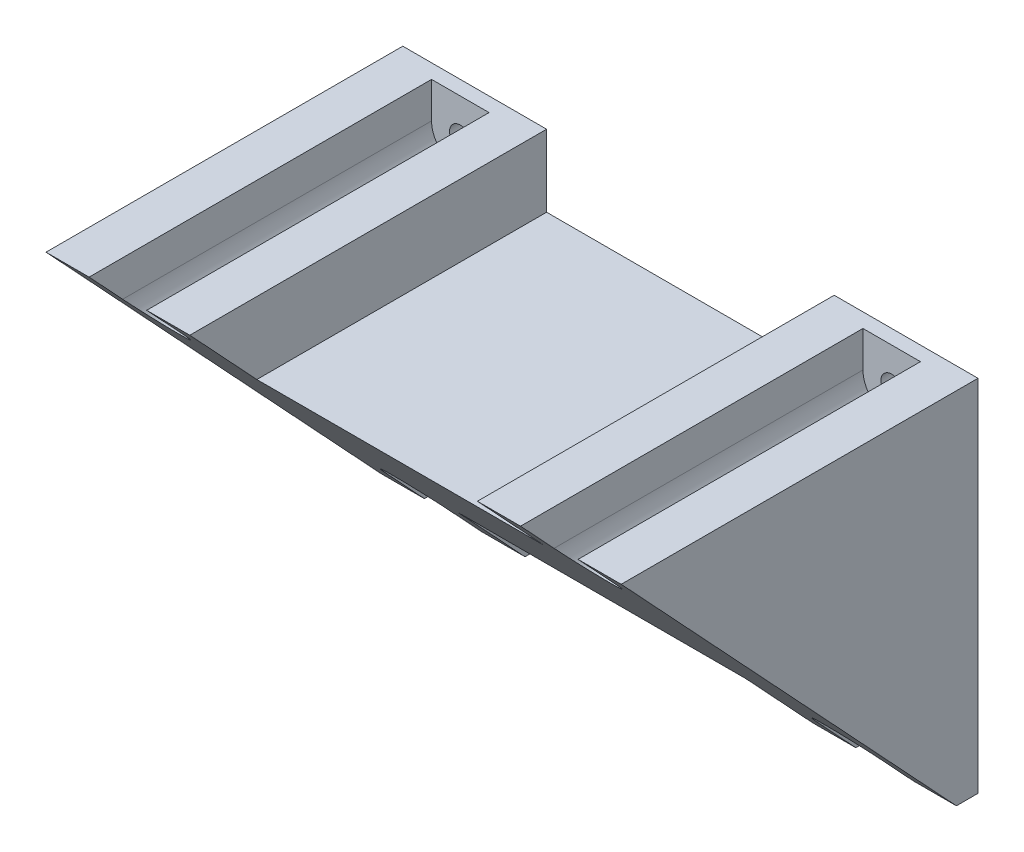
ISO-10303-21;
HEADER;
FILE_DESCRIPTION(('STEP AP214'),'2;1');
FILE_NAME('part.step','',(''),(''),'','','');
FILE_SCHEMA(('AUTOMOTIVE_DESIGN { 1 0 10303 214 1 1 1 1 }'));
ENDSEC;
DATA;
#1=APPLICATION_CONTEXT('core data for automotive mechanical design processes');
#2=APPLICATION_PROTOCOL_DEFINITION('international standard','automotive_design',2000,#1);
#3=PRODUCT_CONTEXT('',#1,'mechanical');
#4=PRODUCT('Part','Part','',(#3));
#5=PRODUCT_RELATED_PRODUCT_CATEGORY('part','',(#4));
#6=PRODUCT_DEFINITION_FORMATION('','',#4);
#7=PRODUCT_DEFINITION_CONTEXT('part definition',#1,'design');
#8=PRODUCT_DEFINITION('design','',#6,#7);
#9=PRODUCT_DEFINITION_SHAPE('','',#8);
#10=(LENGTH_UNIT() NAMED_UNIT(*) SI_UNIT(.MILLI.,.METRE.));
#11=(NAMED_UNIT(*) PLANE_ANGLE_UNIT() SI_UNIT($,.RADIAN.));
#12=(NAMED_UNIT(*) SI_UNIT($,.STERADIAN.) SOLID_ANGLE_UNIT());
#13=UNCERTAINTY_MEASURE_WITH_UNIT(LENGTH_MEASURE(1.E-05),#10,'distance_accuracy_value','');
#14=(GEOMETRIC_REPRESENTATION_CONTEXT(3) GLOBAL_UNCERTAINTY_ASSIGNED_CONTEXT((#13)) GLOBAL_UNIT_ASSIGNED_CONTEXT((#10,
#11,#12)) REPRESENTATION_CONTEXT('',''));
#15=CARTESIAN_POINT('',(0.,0.,0.));
#16=DIRECTION('',(0.,0.,1.));
#17=DIRECTION('',(1.,0.,0.));
#18=AXIS2_PLACEMENT_3D('',#15,#16,#17);
#19=CARTESIAN_POINT('',(0.,0.,2.));
#20=DIRECTION('',(0.,0.,-1.));
#21=DIRECTION('',(-1.,0.,0.));
#22=AXIS2_PLACEMENT_3D('',#19,#20,#21);
#23=PLANE('',#22);
#24=CARTESIAN_POINT('',(9.99999999999999,45.,2.));
#25=DIRECTION('',(0.,0.,1.));
#26=DIRECTION('',(1.,0.,0.));
#27=AXIS2_PLACEMENT_3D('',#24,#25,#26);
#28=CIRCLE('',#27,1.5);
#29=CARTESIAN_POINT('',(11.5,45.,2.));
#30=VERTEX_POINT('',#29);
#31=EDGE_CURVE('E298',#30,#30,#28,.T.);
#32=ORIENTED_EDGE('',*,*,#31,.F.);
#33=EDGE_LOOP('',(#32));
#34=FACE_BOUND('',#33,.T.);
#35=DIRECTION('',(0.,1.,0.));
#36=VECTOR('',#35,1.);
#37=CARTESIAN_POINT('',(6.,50.,2.));
#38=LINE('',#37,#36);
#39=CARTESIAN_POINT('',(6.,45.,2.));
#40=VERTEX_POINT('',#39);
#41=CARTESIAN_POINT('',(6.,50.,2.));
#42=VERTEX_POINT('',#41);
#43=EDGE_CURVE('E55',#40,#42,#38,.T.);
#44=ORIENTED_EDGE('',*,*,#43,.F.);
#45=CARTESIAN_POINT('',(10.,45.,2.));
#46=DIRECTION('',(0.,0.,-1.));
#47=DIRECTION('',(1.,0.,0.));
#48=AXIS2_PLACEMENT_3D('',#45,#46,#47);
#49=CIRCLE('',#48,4.);
#50=CARTESIAN_POINT('',(14.,45.,2.));
#51=VERTEX_POINT('',#50);
#52=EDGE_CURVE('E459',#51,#40,#49,.T.);
#53=ORIENTED_EDGE('',*,*,#52,.F.);
#54=DIRECTION('',(0.,-1.,0.));
#55=VECTOR('',#54,1.);
#56=CARTESIAN_POINT('',(14.,45.,2.));
#57=LINE('',#56,#55);
#58=CARTESIAN_POINT('',(14.,50.,2.));
#59=VERTEX_POINT('',#58);
#60=EDGE_CURVE('E239',#59,#51,#57,.T.);
#61=ORIENTED_EDGE('',*,*,#60,.F.);
#62=DIRECTION('',(-1.,0.,0.));
#63=VECTOR('',#62,1.);
#64=CARTESIAN_POINT('',(20.,50.,2.));
#65=LINE('',#64,#63);
#66=EDGE_CURVE('E319',#59,#42,#65,.T.);
#67=ORIENTED_EDGE('',*,*,#66,.T.);
#68=EDGE_LOOP('',(#44,#53,#61,#67));
#69=FACE_BOUND('',#68,.T.);
#70=ADVANCED_FACE('F36',(#34,#69),#23,.F.);
#71=CARTESIAN_POINT('',(70.,45.,2.));
#72=DIRECTION('',(0.,0.,1.));
#73=DIRECTION('',(1.,0.,0.));
#74=AXIS2_PLACEMENT_3D('',#71,#72,#73);
#75=CIRCLE('',#74,1.5);
#76=CARTESIAN_POINT('',(71.5,45.,2.));
#77=VERTEX_POINT('',#76);
#78=EDGE_CURVE('E292',#77,#77,#75,.T.);
#79=ORIENTED_EDGE('',*,*,#78,.F.);
#80=EDGE_LOOP('',(#79));
#81=FACE_BOUND('',#80,.T.);
#82=DIRECTION('',(0.,1.,0.));
#83=VECTOR('',#82,1.);
#84=CARTESIAN_POINT('',(66.,50.,2.));
#85=LINE('',#84,#83);
#86=CARTESIAN_POINT('',(66.,45.,2.));
#87=VERTEX_POINT('',#86);
#88=CARTESIAN_POINT('',(66.,50.,2.));
#89=VERTEX_POINT('',#88);
#90=EDGE_CURVE('E228',#87,#89,#85,.T.);
#91=ORIENTED_EDGE('',*,*,#90,.F.);
#92=CARTESIAN_POINT('',(70.,45.,2.));
#93=DIRECTION('',(0.,0.,-1.));
#94=DIRECTION('',(1.,0.,0.));
#95=AXIS2_PLACEMENT_3D('',#92,#93,#94);
#96=CIRCLE('',#95,3.99999999999999);
#97=CARTESIAN_POINT('',(74.,45.,2.));
#98=VERTEX_POINT('',#97);
#99=EDGE_CURVE('E231',#98,#87,#96,.T.);
#100=ORIENTED_EDGE('',*,*,#99,.F.);
#101=DIRECTION('',(0.,-1.,0.));
#102=VECTOR('',#101,1.);
#103=CARTESIAN_POINT('',(74.,45.,2.));
#104=LINE('',#103,#102);
#105=CARTESIAN_POINT('',(74.,50.,2.));
#106=VERTEX_POINT('',#105);
#107=EDGE_CURVE('E250',#106,#98,#104,.T.);
#108=ORIENTED_EDGE('',*,*,#107,.F.);
#109=DIRECTION('',(-1.,0.,0.));
#110=VECTOR('',#109,1.);
#111=CARTESIAN_POINT('',(60.,50.,2.));
#112=LINE('',#111,#110);
#113=EDGE_CURVE('E234',#106,#89,#112,.T.);
#114=ORIENTED_EDGE('',*,*,#113,.T.);
#115=EDGE_LOOP('',(#91,#100,#108,#114));
#116=FACE_BOUND('',#115,.T.);
#117=ADVANCED_FACE('F230',(#81,#116),#23,.F.);
#118=CARTESIAN_POINT('',(70.,5.,2.));
#119=DIRECTION('',(0.,0.,1.));
#120=DIRECTION('',(1.,0.,0.));
#121=AXIS2_PLACEMENT_3D('',#118,#119,#120);
#122=CIRCLE('',#121,1.5);
#123=CARTESIAN_POINT('',(71.5,5.,2.));
#124=VERTEX_POINT('',#123);
#125=EDGE_CURVE('E288',#124,#124,#122,.T.);
#126=ORIENTED_EDGE('',*,*,#125,.F.);
#127=EDGE_LOOP('',(#126));
#128=FACE_BOUND('',#127,.T.);
#129=DIRECTION('',(0.,-1.,0.));
#130=VECTOR('',#129,1.);
#131=CARTESIAN_POINT('',(74.,0.,2.));
#132=LINE('',#131,#130);
#133=CARTESIAN_POINT('',(74.,5.,2.));
#134=VERTEX_POINT('',#133);
#135=CARTESIAN_POINT('',(74.,0.,2.));
#136=VERTEX_POINT('',#135);
#137=EDGE_CURVE('E453',#134,#136,#132,.T.);
#138=ORIENTED_EDGE('',*,*,#137,.F.);
#139=CARTESIAN_POINT('',(70.,5.,2.));
#140=DIRECTION('',(0.,0.,-1.));
#141=DIRECTION('',(1.,0.,0.));
#142=AXIS2_PLACEMENT_3D('',#139,#140,#141);
#143=CIRCLE('',#142,4.);
#144=CARTESIAN_POINT('',(66.,5.,2.));
#145=VERTEX_POINT('',#144);
#146=EDGE_CURVE('E450',#145,#134,#143,.T.);
#147=ORIENTED_EDGE('',*,*,#146,.F.);
#148=DIRECTION('',(0.,1.,0.));
#149=VECTOR('',#148,1.);
#150=CARTESIAN_POINT('',(66.,5.,2.));
#151=LINE('',#150,#149);
#152=CARTESIAN_POINT('',(66.,0.,2.));
#153=VERTEX_POINT('',#152);
#154=EDGE_CURVE('E447',#153,#145,#151,.T.);
#155=ORIENTED_EDGE('',*,*,#154,.F.);
#156=DIRECTION('',(1.,0.,0.));
#157=VECTOR('',#156,1.);
#158=CARTESIAN_POINT('',(80.,0.,2.));
#159=LINE('',#158,#157);
#160=EDGE_CURVE('E315',#153,#136,#159,.T.);
#161=ORIENTED_EDGE('',*,*,#160,.T.);
#162=EDGE_LOOP('',(#138,#147,#155,#161));
#163=FACE_BOUND('',#162,.T.);
#164=ADVANCED_FACE('F574',(#128,#163),#23,.F.);
#165=CARTESIAN_POINT('',(10.,5.,2.));
#166=DIRECTION('',(0.,0.,1.));
#167=DIRECTION('',(1.,0.,0.));
#168=AXIS2_PLACEMENT_3D('',#165,#166,#167);
#169=CIRCLE('',#168,1.5);
#170=CARTESIAN_POINT('',(11.5,5.,2.));
#171=VERTEX_POINT('',#170);
#172=EDGE_CURVE('E299',#171,#171,#169,.T.);
#173=ORIENTED_EDGE('',*,*,#172,.F.);
#174=EDGE_LOOP('',(#173));
#175=FACE_BOUND('',#174,.T.);
#176=DIRECTION('',(0.,-1.,0.));
#177=VECTOR('',#176,1.);
#178=CARTESIAN_POINT('',(14.,0.,2.));
#179=LINE('',#178,#177);
#180=CARTESIAN_POINT('',(14.,5.,2.));
#181=VERTEX_POINT('',#180);
#182=CARTESIAN_POINT('',(14.,0.,2.));
#183=VERTEX_POINT('',#182);
#184=EDGE_CURVE('E444',#181,#183,#179,.T.);
#185=ORIENTED_EDGE('',*,*,#184,.F.);
#186=CARTESIAN_POINT('',(10.,5.,2.));
#187=DIRECTION('',(0.,0.,-1.));
#188=DIRECTION('',(1.,0.,0.));
#189=AXIS2_PLACEMENT_3D('',#186,#187,#188);
#190=CIRCLE('',#189,4.);
#191=CARTESIAN_POINT('',(6.,5.,2.));
#192=VERTEX_POINT('',#191);
#193=EDGE_CURVE('E441',#192,#181,#190,.T.);
#194=ORIENTED_EDGE('',*,*,#193,.F.);
#195=DIRECTION('',(0.,1.,0.));
#196=VECTOR('',#195,1.);
#197=CARTESIAN_POINT('',(6.,4.99999999999999,2.));
#198=LINE('',#197,#196);
#199=CARTESIAN_POINT('',(6.,0.,2.));
#200=VERTEX_POINT('',#199);
#201=EDGE_CURVE('E438',#200,#192,#198,.T.);
#202=ORIENTED_EDGE('',*,*,#201,.F.);
#203=DIRECTION('',(1.,0.,0.));
#204=VECTOR('',#203,1.);
#205=CARTESIAN_POINT('',(20.,0.,2.));
#206=LINE('',#205,#204);
#207=EDGE_CURVE('E313',#200,#183,#206,.T.);
#208=ORIENTED_EDGE('',*,*,#207,.T.);
#209=EDGE_LOOP('',(#185,#194,#202,#208));
#210=FACE_BOUND('',#209,.T.);
#211=ADVANCED_FACE('F570',(#175,#210),#23,.F.);
#212=CARTESIAN_POINT('',(20.,0.,2.));
#213=DIRECTION('',(0.,1.,0.));
#214=DIRECTION('',(-1.,0.,0.));
#215=AXIS2_PLACEMENT_3D('',#212,#213,#214);
#216=PLANE('',#215);
#217=DIRECTION('',(1.,0.,0.));
#218=VECTOR('',#217,1.);
#219=CARTESIAN_POINT('',(20.,0.,0.));
#220=LINE('',#219,#218);
#221=CARTESIAN_POINT('',(0.,0.,0.));
#222=VERTEX_POINT('',#221);
#223=CARTESIAN_POINT('',(20.,0.,0.));
#224=VERTEX_POINT('',#223);
#225=EDGE_CURVE('E310',#222,#224,#220,.T.);
#226=ORIENTED_EDGE('',*,*,#225,.T.);
#227=DIRECTION('',(0.,0.,-1.));
#228=VECTOR('',#227,1.);
#229=CARTESIAN_POINT('',(20.,0.,2.));
#230=LINE('',#229,#228);
#231=CARTESIAN_POINT('',(20.,0.,2.99999999999999));
#232=VERTEX_POINT('',#231);
#233=EDGE_CURVE('E11',#232,#224,#230,.T.);
#234=ORIENTED_EDGE('',*,*,#233,.F.);
#235=DIRECTION('',(1.,0.,0.));
#236=VECTOR('',#235,1.);
#237=CARTESIAN_POINT('',(20.,0.,2.99999999999999));
#238=LINE('',#237,#236);
#239=CARTESIAN_POINT('',(14.,0.,2.99999999999999));
#240=VERTEX_POINT('',#239);
#241=EDGE_CURVE('E432',#240,#232,#238,.T.);
#242=ORIENTED_EDGE('',*,*,#241,.F.);
#243=DIRECTION('',(0.,0.,-1.));
#244=VECTOR('',#243,1.);
#245=CARTESIAN_POINT('',(14.,0.,2.99999999999999));
#246=LINE('',#245,#244);
#247=EDGE_CURVE('E276',#240,#183,#246,.T.);
#248=ORIENTED_EDGE('',*,*,#247,.T.);
#249=ORIENTED_EDGE('',*,*,#207,.F.);
#250=DIRECTION('',(0.,0.,-1.));
#251=VECTOR('',#250,1.);
#252=CARTESIAN_POINT('',(6.,0.,2.99999999999999));
#253=LINE('',#252,#251);
#254=CARTESIAN_POINT('',(6.,0.,2.99999999999999));
#255=VERTEX_POINT('',#254);
#256=EDGE_CURVE('E285',#255,#200,#253,.T.);
#257=ORIENTED_EDGE('',*,*,#256,.F.);
#258=DIRECTION('',(1.,0.,0.));
#259=VECTOR('',#258,1.);
#260=CARTESIAN_POINT('',(6.,0.,2.99999999999999));
#261=LINE('',#260,#259);
#262=CARTESIAN_POINT('',(0.,0.,2.99999999999999));
#263=VERTEX_POINT('',#262);
#264=EDGE_CURVE('E148',#263,#255,#261,.T.);
#265=ORIENTED_EDGE('',*,*,#264,.F.);
#266=DIRECTION('',(0.,0.,-1.));
#267=VECTOR('',#266,1.);
#268=CARTESIAN_POINT('',(0.,0.,2.));
#269=LINE('',#268,#267);
#270=EDGE_CURVE('E321',#263,#222,#269,.T.);
#271=ORIENTED_EDGE('',*,*,#270,.T.);
#272=EDGE_LOOP('',(#226,#234,#242,#248,#249,#257,#265,#271));
#273=FACE_BOUND('',#272,.T.);
#274=ADVANCED_FACE('F503',(#273),#216,.F.);
#275=CARTESIAN_POINT('',(20.,10.,2.));
#276=DIRECTION('',(-1.,0.,0.));
#277=DIRECTION('',(0.,0.,1.));
#278=AXIS2_PLACEMENT_3D('',#275,#276,#277);
#279=PLANE('',#278);
#280=DIRECTION('',(0.,1.,0.));
#281=VECTOR('',#280,1.);
#282=CARTESIAN_POINT('',(20.,10.,0.));
#283=LINE('',#282,#281);
#284=CARTESIAN_POINT('',(20.,10.,0.));
#285=VERTEX_POINT('',#284);
#286=EDGE_CURVE('E324',#224,#285,#283,.T.);
#287=ORIENTED_EDGE('',*,*,#286,.T.);
#288=DIRECTION('',(0.,0.,-1.));
#289=VECTOR('',#288,1.);
#290=CARTESIAN_POINT('',(20.,10.,2.));
#291=LINE('',#290,#289);
#292=CARTESIAN_POINT('',(20.,10.,12.3251508613766));
#293=VERTEX_POINT('',#292);
#294=EDGE_CURVE('E46',#293,#285,#291,.T.);
#295=ORIENTED_EDGE('',*,*,#294,.F.);
#296=DIRECTION('',(0.,0.731353701619169,0.6819983600625));
#297=VECTOR('',#296,1.);
#298=CARTESIAN_POINT('',(20.,4.8500003435907,7.52269848817118));
#299=LINE('',#298,#297);
#300=EDGE_CURVE('E429',#232,#293,#299,.T.);
#301=ORIENTED_EDGE('',*,*,#300,.F.);
#302=ORIENTED_EDGE('',*,*,#233,.T.);
#303=EDGE_LOOP('',(#287,#295,#301,#302));
#304=FACE_BOUND('',#303,.T.);
#305=ADVANCED_FACE('F517',(#304),#279,.F.);
#306=CARTESIAN_POINT('',(60.,10.,2.));
#307=DIRECTION('',(0.,1.,0.));
#308=DIRECTION('',(-1.,0.,0.));
#309=AXIS2_PLACEMENT_3D('',#306,#307,#308);
#310=PLANE('',#309);
#311=DIRECTION('',(1.,0.,0.));
#312=VECTOR('',#311,1.);
#313=CARTESIAN_POINT('',(60.,10.,0.));
#314=LINE('',#313,#312);
#315=CARTESIAN_POINT('',(60.,10.,0.));
#316=VERTEX_POINT('',#315);
#317=EDGE_CURVE('E326',#285,#316,#314,.T.);
#318=ORIENTED_EDGE('',*,*,#317,.T.);
#319=DIRECTION('',(0.,0.,-1.));
#320=VECTOR('',#319,1.);
#321=CARTESIAN_POINT('',(60.,10.,2.));
#322=LINE('',#321,#320);
#323=CARTESIAN_POINT('',(60.,10.,12.3251508613766));
#324=VERTEX_POINT('',#323);
#325=EDGE_CURVE('E371',#324,#316,#322,.T.);
#326=ORIENTED_EDGE('',*,*,#325,.F.);
#327=DIRECTION('',(1.,0.,0.));
#328=VECTOR('',#327,1.);
#329=CARTESIAN_POINT('',(60.,10.,12.3251508613766));
#330=LINE('',#329,#328);
#331=EDGE_CURVE('E426',#293,#324,#330,.T.);
#332=ORIENTED_EDGE('',*,*,#331,.F.);
#333=ORIENTED_EDGE('',*,*,#294,.T.);
#334=EDGE_LOOP('',(#318,#326,#332,#333));
#335=FACE_BOUND('',#334,.T.);
#336=ADVANCED_FACE('F520',(#335),#310,.F.);
#337=CARTESIAN_POINT('',(60.,0.,2.));
#338=DIRECTION('',(1.,0.,0.));
#339=DIRECTION('',(0.,0.,-1.));
#340=AXIS2_PLACEMENT_3D('',#337,#338,#339);
#341=PLANE('',#340);
#342=DIRECTION('',(0.,-1.,0.));
#343=VECTOR('',#342,1.);
#344=CARTESIAN_POINT('',(60.,0.,0.));
#345=LINE('',#344,#343);
#346=CARTESIAN_POINT('',(60.,0.,0.));
#347=VERTEX_POINT('',#346);
#348=EDGE_CURVE('E328',#316,#347,#345,.T.);
#349=ORIENTED_EDGE('',*,*,#348,.T.);
#350=DIRECTION('',(0.,0.,-1.));
#351=VECTOR('',#350,1.);
#352=CARTESIAN_POINT('',(60.,0.,2.));
#353=LINE('',#352,#351);
#354=CARTESIAN_POINT('',(60.,0.,2.99999999999999));
#355=VERTEX_POINT('',#354);
#356=EDGE_CURVE('E368',#355,#347,#353,.T.);
#357=ORIENTED_EDGE('',*,*,#356,.F.);
#358=DIRECTION('',(0.,-0.731353701619169,-0.6819983600625));
#359=VECTOR('',#358,1.);
#360=CARTESIAN_POINT('',(60.,-0.498782025129913,2.53487823687205));
#361=LINE('',#360,#359);
#362=EDGE_CURVE('E423',#324,#355,#361,.T.);
#363=ORIENTED_EDGE('',*,*,#362,.F.);
#364=ORIENTED_EDGE('',*,*,#325,.T.);
#365=EDGE_LOOP('',(#349,#357,#363,#364));
#366=FACE_BOUND('',#365,.T.);
#367=ADVANCED_FACE('F525',(#366),#341,.F.);
#368=CARTESIAN_POINT('',(80.,0.,2.));
#369=DIRECTION('',(0.,1.,0.));
#370=DIRECTION('',(-1.,0.,0.));
#371=AXIS2_PLACEMENT_3D('',#368,#369,#370);
#372=PLANE('',#371);
#373=DIRECTION('',(1.,0.,0.));
#374=VECTOR('',#373,1.);
#375=CARTESIAN_POINT('',(80.,0.,0.));
#376=LINE('',#375,#374);
#377=CARTESIAN_POINT('',(80.,0.,0.));
#378=VERTEX_POINT('',#377);
#379=EDGE_CURVE('E330',#347,#378,#376,.T.);
#380=ORIENTED_EDGE('',*,*,#379,.T.);
#381=DIRECTION('',(0.,0.,-1.));
#382=VECTOR('',#381,1.);
#383=CARTESIAN_POINT('',(80.,0.,2.));
#384=LINE('',#383,#382);
#385=CARTESIAN_POINT('',(80.,0.,2.99999999999999));
#386=VERTEX_POINT('',#385);
#387=EDGE_CURVE('E365',#386,#378,#384,.T.);
#388=ORIENTED_EDGE('',*,*,#387,.F.);
#389=DIRECTION('',(1.,0.,0.));
#390=VECTOR('',#389,1.);
#391=CARTESIAN_POINT('',(80.,0.,2.99999999999999));
#392=LINE('',#391,#390);
#393=CARTESIAN_POINT('',(74.,0.,2.99999999999999));
#394=VERTEX_POINT('',#393);
#395=EDGE_CURVE('E412',#394,#386,#392,.T.);
#396=ORIENTED_EDGE('',*,*,#395,.F.);
#397=DIRECTION('',(0.,0.,-1.));
#398=VECTOR('',#397,1.);
#399=CARTESIAN_POINT('',(74.,0.,2.99999999999999));
#400=LINE('',#399,#398);
#401=EDGE_CURVE('E264',#394,#136,#400,.T.);
#402=ORIENTED_EDGE('',*,*,#401,.T.);
#403=ORIENTED_EDGE('',*,*,#160,.F.);
#404=DIRECTION('',(0.,0.,-1.));
#405=VECTOR('',#404,1.);
#406=CARTESIAN_POINT('',(66.,0.,2.99999999999999));
#407=LINE('',#406,#405);
#408=CARTESIAN_POINT('',(66.,0.,2.99999999999999));
#409=VERTEX_POINT('',#408);
#410=EDGE_CURVE('E273',#409,#153,#407,.T.);
#411=ORIENTED_EDGE('',*,*,#410,.F.);
#412=DIRECTION('',(1.,0.,0.));
#413=VECTOR('',#412,1.);
#414=CARTESIAN_POINT('',(80.,0.,2.99999999999999));
#415=LINE('',#414,#413);
#416=EDGE_CURVE('E421',#355,#409,#415,.T.);
#417=ORIENTED_EDGE('',*,*,#416,.F.);
#418=ORIENTED_EDGE('',*,*,#356,.T.);
#419=EDGE_LOOP('',(#380,#388,#396,#402,#403,#411,#417,#418));
#420=FACE_BOUND('',#419,.T.);
#421=ADVANCED_FACE('F529',(#420),#372,.F.);
#422=CARTESIAN_POINT('',(80.,50.,2.));
#423=DIRECTION('',(-1.,0.,0.));
#424=DIRECTION('',(0.,0.,1.));
#425=AXIS2_PLACEMENT_3D('',#422,#423,#424);
#426=PLANE('',#425);
#427=DIRECTION('',(0.,1.,0.));
#428=VECTOR('',#427,1.);
#429=CARTESIAN_POINT('',(80.,50.,0.));
#430=LINE('',#429,#428);
#431=CARTESIAN_POINT('',(80.,50.,0.));
#432=VERTEX_POINT('',#431);
#433=EDGE_CURVE('E332',#378,#432,#430,.T.);
#434=ORIENTED_EDGE('',*,*,#433,.T.);
#435=DIRECTION('',(0.,0.,-1.));
#436=VECTOR('',#435,1.);
#437=CARTESIAN_POINT('',(80.,50.,2.));
#438=LINE('',#437,#436);
#439=CARTESIAN_POINT('',(80.,50.,49.6257543068833));
#440=VERTEX_POINT('',#439);
#441=EDGE_CURVE('E362',#440,#432,#438,.T.);
#442=ORIENTED_EDGE('',*,*,#441,.F.);
#443=DIRECTION('',(0.,0.731353701619169,0.6819983600625));
#444=VECTOR('',#443,1.);
#445=CARTESIAN_POINT('',(80.,26.2451298184731,27.4739794933677));
#446=LINE('',#445,#444);
#447=EDGE_CURVE('E409',#386,#440,#446,.T.);
#448=ORIENTED_EDGE('',*,*,#447,.F.);
#449=ORIENTED_EDGE('',*,*,#387,.T.);
#450=EDGE_LOOP('',(#434,#442,#448,#449));
#451=FACE_BOUND('',#450,.T.);
#452=ADVANCED_FACE('F548',(#451),#426,.F.);
#453=CARTESIAN_POINT('',(60.,50.,2.));
#454=DIRECTION('',(0.,-1.,0.));
#455=DIRECTION('',(0.,0.,-1.));
#456=AXIS2_PLACEMENT_3D('',#453,#454,#455);
#457=PLANE('',#456);
#458=DIRECTION('',(-1.,0.,0.));
#459=VECTOR('',#458,1.);
#460=CARTESIAN_POINT('',(60.,50.,0.));
#461=LINE('',#460,#459);
#462=CARTESIAN_POINT('',(60.,50.,0.));
#463=VERTEX_POINT('',#462);
#464=EDGE_CURVE('E334',#432,#463,#461,.T.);
#465=ORIENTED_EDGE('',*,*,#464,.T.);
#466=DIRECTION('',(0.,0.,-1.));
#467=VECTOR('',#466,1.);
#468=CARTESIAN_POINT('',(60.,50.,2.));
#469=LINE('',#468,#467);
#470=CARTESIAN_POINT('',(60.,50.,49.6257543068833));
#471=VERTEX_POINT('',#470);
#472=EDGE_CURVE('E359',#471,#463,#469,.T.);
#473=ORIENTED_EDGE('',*,*,#472,.F.);
#474=DIRECTION('',(-1.,0.,0.));
#475=VECTOR('',#474,1.);
#476=CARTESIAN_POINT('',(60.,50.,49.6257543068833));
#477=LINE('',#476,#475);
#478=CARTESIAN_POINT('',(66.,50.,49.6257543068832));
#479=VERTEX_POINT('',#478);
#480=EDGE_CURVE('E399',#479,#471,#477,.T.);
#481=ORIENTED_EDGE('',*,*,#480,.F.);
#482=DIRECTION('',(0.,0.,-1.));
#483=VECTOR('',#482,1.);
#484=CARTESIAN_POINT('',(66.,50.,2.99999999999999));
#485=LINE('',#484,#483);
#486=EDGE_CURVE('E254',#479,#89,#485,.T.);
#487=ORIENTED_EDGE('',*,*,#486,.T.);
#488=ORIENTED_EDGE('',*,*,#113,.F.);
#489=DIRECTION('',(0.,0.,-1.));
#490=VECTOR('',#489,1.);
#491=CARTESIAN_POINT('',(74.,50.,2.99999999999999));
#492=LINE('',#491,#490);
#493=CARTESIAN_POINT('',(74.,50.,49.6257543068833));
#494=VERTEX_POINT('',#493);
#495=EDGE_CURVE('E256',#494,#106,#492,.T.);
#496=ORIENTED_EDGE('',*,*,#495,.F.);
#497=DIRECTION('',(-1.,0.,0.));
#498=VECTOR('',#497,1.);
#499=CARTESIAN_POINT('',(60.,50.,49.6257543068833));
#500=LINE('',#499,#498);
#501=EDGE_CURVE('E407',#440,#494,#500,.T.);
#502=ORIENTED_EDGE('',*,*,#501,.F.);
#503=ORIENTED_EDGE('',*,*,#441,.T.);
#504=EDGE_LOOP('',(#465,#473,#481,#487,#488,#496,#502,#503));
#505=FACE_BOUND('',#504,.T.);
#506=ADVANCED_FACE('F551',(#505),#457,.F.);
#507=CARTESIAN_POINT('',(60.,50.,2.));
#508=DIRECTION('',(1.,0.,0.));
#509=DIRECTION('',(0.,1.,0.));
#510=AXIS2_PLACEMENT_3D('',#507,#508,#509);
#511=PLANE('',#510);
#512=DIRECTION('',(0.,-1.,0.));
#513=VECTOR('',#512,1.);
#514=CARTESIAN_POINT('',(60.,50.,0.));
#515=LINE('',#514,#513);
#516=CARTESIAN_POINT('',(60.,40.,0.));
#517=VERTEX_POINT('',#516);
#518=EDGE_CURVE('E336',#463,#517,#515,.T.);
#519=ORIENTED_EDGE('',*,*,#518,.T.);
#520=DIRECTION('',(0.,0.,-1.));
#521=VECTOR('',#520,1.);
#522=CARTESIAN_POINT('',(60.,40.,2.));
#523=LINE('',#522,#521);
#524=CARTESIAN_POINT('',(60.,40.,40.3006034455066));
#525=VERTEX_POINT('',#524);
#526=EDGE_CURVE('E356',#525,#517,#523,.T.);
#527=ORIENTED_EDGE('',*,*,#526,.F.);
#528=DIRECTION('',(0.,-0.731353701619169,-0.6819983600625));
#529=VECTOR('',#528,1.);
#530=CARTESIAN_POINT('',(60.,26.2451298184731,27.4739794933677));
#531=LINE('',#530,#529);
#532=EDGE_CURVE('E396',#471,#525,#531,.T.);
#533=ORIENTED_EDGE('',*,*,#532,.F.);
#534=ORIENTED_EDGE('',*,*,#472,.T.);
#535=EDGE_LOOP('',(#519,#527,#533,#534));
#536=FACE_BOUND('',#535,.T.);
#537=ADVANCED_FACE('F555',(#536),#511,.F.);
#538=CARTESIAN_POINT('',(60.,40.,2.));
#539=DIRECTION('',(0.,-1.,0.));
#540=DIRECTION('',(1.,0.,0.));
#541=AXIS2_PLACEMENT_3D('',#538,#539,#540);
#542=PLANE('',#541);
#543=DIRECTION('',(-1.,0.,0.));
#544=VECTOR('',#543,1.);
#545=CARTESIAN_POINT('',(60.,40.,0.));
#546=LINE('',#545,#544);
#547=CARTESIAN_POINT('',(20.,40.,0.));
#548=VERTEX_POINT('',#547);
#549=EDGE_CURVE('E338',#517,#548,#546,.T.);
#550=ORIENTED_EDGE('',*,*,#549,.T.);
#551=DIRECTION('',(0.,0.,-1.));
#552=VECTOR('',#551,1.);
#553=CARTESIAN_POINT('',(20.,40.,2.));
#554=LINE('',#553,#552);
#555=CARTESIAN_POINT('',(20.,40.,40.3006034455066));
#556=VERTEX_POINT('',#555);
#557=EDGE_CURVE('E353',#556,#548,#554,.T.);
#558=ORIENTED_EDGE('',*,*,#557,.F.);
#559=DIRECTION('',(-1.,0.,0.));
#560=VECTOR('',#559,1.);
#561=CARTESIAN_POINT('',(60.,40.,40.3006034455066));
#562=LINE('',#561,#560);
#563=EDGE_CURVE('E393',#525,#556,#562,.T.);
#564=ORIENTED_EDGE('',*,*,#563,.F.);
#565=ORIENTED_EDGE('',*,*,#526,.T.);
#566=EDGE_LOOP('',(#550,#558,#564,#565));
#567=FACE_BOUND('',#566,.T.);
#568=ADVANCED_FACE('F558',(#567),#542,.F.);
#569=CARTESIAN_POINT('',(20.,50.,2.));
#570=DIRECTION('',(-1.,0.,0.));
#571=DIRECTION('',(0.,-1.,0.));
#572=AXIS2_PLACEMENT_3D('',#569,#570,#571);
#573=PLANE('',#572);
#574=DIRECTION('',(0.,1.,0.));
#575=VECTOR('',#574,1.);
#576=CARTESIAN_POINT('',(20.,50.,0.));
#577=LINE('',#576,#575);
#578=CARTESIAN_POINT('',(20.,50.,0.));
#579=VERTEX_POINT('',#578);
#580=EDGE_CURVE('E340',#548,#579,#577,.T.);
#581=ORIENTED_EDGE('',*,*,#580,.T.);
#582=DIRECTION('',(0.,0.,-1.));
#583=VECTOR('',#582,1.);
#584=CARTESIAN_POINT('',(20.,50.,2.));
#585=LINE('',#584,#583);
#586=CARTESIAN_POINT('',(20.,50.,49.6257543068832));
#587=VERTEX_POINT('',#586);
#588=EDGE_CURVE('E350',#587,#579,#585,.T.);
#589=ORIENTED_EDGE('',*,*,#588,.F.);
#590=DIRECTION('',(0.,0.731353701619169,0.6819983600625));
#591=VECTOR('',#590,1.);
#592=CARTESIAN_POINT('',(20.,26.2451298184731,27.4739794933677));
#593=LINE('',#592,#591);
#594=EDGE_CURVE('E390',#556,#587,#593,.T.);
#595=ORIENTED_EDGE('',*,*,#594,.F.);
#596=ORIENTED_EDGE('',*,*,#557,.T.);
#597=EDGE_LOOP('',(#581,#589,#595,#596));
#598=FACE_BOUND('',#597,.T.);
#599=ADVANCED_FACE('F491',(#598),#573,.F.);
#600=CARTESIAN_POINT('',(20.,50.,2.));
#601=DIRECTION('',(0.,-1.,0.));
#602=DIRECTION('',(1.,0.,0.));
#603=AXIS2_PLACEMENT_3D('',#600,#601,#602);
#604=PLANE('',#603);
#605=DIRECTION('',(-1.,0.,0.));
#606=VECTOR('',#605,1.);
#607=CARTESIAN_POINT('',(20.,50.,0.));
#608=LINE('',#607,#606);
#609=CARTESIAN_POINT('',(0.,50.,0.));
#610=VERTEX_POINT('',#609);
#611=EDGE_CURVE('E342',#579,#610,#608,.T.);
#612=ORIENTED_EDGE('',*,*,#611,.T.);
#613=DIRECTION('',(0.,0.,-1.));
#614=VECTOR('',#613,1.);
#615=CARTESIAN_POINT('',(0.,50.,2.));
#616=LINE('',#615,#614);
#617=CARTESIAN_POINT('',(0.,50.,49.6257543068832));
#618=VERTEX_POINT('',#617);
#619=EDGE_CURVE('E347',#618,#610,#616,.T.);
#620=ORIENTED_EDGE('',*,*,#619,.F.);
#621=DIRECTION('',(-1.,0.,0.));
#622=VECTOR('',#621,1.);
#623=CARTESIAN_POINT('',(20.,50.,49.6257543068832));
#624=LINE('',#623,#622);
#625=CARTESIAN_POINT('',(6.,50.,49.6257543068832));
#626=VERTEX_POINT('',#625);
#627=EDGE_CURVE('E378',#626,#618,#624,.T.);
#628=ORIENTED_EDGE('',*,*,#627,.F.);
#629=DIRECTION('',(0.,0.,-1.));
#630=VECTOR('',#629,1.);
#631=CARTESIAN_POINT('',(6.,50.,2.99999999999999));
#632=LINE('',#631,#630);
#633=EDGE_CURVE('E381',#626,#42,#632,.T.);
#634=ORIENTED_EDGE('',*,*,#633,.T.);
#635=ORIENTED_EDGE('',*,*,#66,.F.);
#636=DIRECTION('',(0.,0.,-1.));
#637=VECTOR('',#636,1.);
#638=CARTESIAN_POINT('',(14.,50.,2.99999999999999));
#639=LINE('',#638,#637);
#640=CARTESIAN_POINT('',(14.,50.,49.6257543068832));
#641=VERTEX_POINT('',#640);
#642=EDGE_CURVE('E258',#641,#59,#639,.T.);
#643=ORIENTED_EDGE('',*,*,#642,.F.);
#644=DIRECTION('',(-1.,0.,0.));
#645=VECTOR('',#644,1.);
#646=CARTESIAN_POINT('',(20.,50.,49.6257543068832));
#647=LINE('',#646,#645);
#648=EDGE_CURVE('E388',#587,#641,#647,.T.);
#649=ORIENTED_EDGE('',*,*,#648,.F.);
#650=ORIENTED_EDGE('',*,*,#588,.T.);
#651=EDGE_LOOP('',(#612,#620,#628,#634,#635,#643,#649,#650));
#652=FACE_BOUND('',#651,.T.);
#653=ADVANCED_FACE('F478',(#652),#604,.F.);
#654=CARTESIAN_POINT('',(0.,0.,2.));
#655=DIRECTION('',(1.,0.,0.));
#656=DIRECTION('',(0.,0.,-1.));
#657=AXIS2_PLACEMENT_3D('',#654,#655,#656);
#658=PLANE('',#657);
#659=DIRECTION('',(0.,-1.,0.));
#660=VECTOR('',#659,1.);
#661=CARTESIAN_POINT('',(0.,0.,0.));
#662=LINE('',#661,#660);
#663=EDGE_CURVE('E316',#610,#222,#662,.T.);
#664=ORIENTED_EDGE('',*,*,#663,.T.);
#665=ORIENTED_EDGE('',*,*,#270,.F.);
#666=DIRECTION('',(0.,-0.731353701619169,-0.6819983600625));
#667=VECTOR('',#666,1.);
#668=CARTESIAN_POINT('',(0.,-0.498782025129911,2.53487823687206));
#669=LINE('',#668,#667);
#670=EDGE_CURVE('E376',#618,#263,#669,.T.);
#671=ORIENTED_EDGE('',*,*,#670,.F.);
#672=ORIENTED_EDGE('',*,*,#619,.T.);
#673=EDGE_LOOP('',(#664,#665,#671,#672));
#674=FACE_BOUND('',#673,.T.);
#675=ADVANCED_FACE('F500',(#674),#658,.F.);
#676=CARTESIAN_POINT('',(0.,0.,0.));
#677=DIRECTION('',(0.,0.,-1.));
#678=DIRECTION('',(-1.,0.,0.));
#679=AXIS2_PLACEMENT_3D('',#676,#677,#678);
#680=PLANE('',#679);
#681=CARTESIAN_POINT('',(10.,5.,0.));
#682=DIRECTION('',(0.,0.,1.));
#683=DIRECTION('',(1.,0.,0.));
#684=AXIS2_PLACEMENT_3D('',#681,#682,#683);
#685=CIRCLE('',#684,1.5);
#686=CARTESIAN_POINT('',(11.5,5.,0.));
#687=VERTEX_POINT('',#686);
#688=EDGE_CURVE('E295',#687,#687,#685,.T.);
#689=ORIENTED_EDGE('',*,*,#688,.T.);
#690=EDGE_LOOP('',(#689));
#691=FACE_BOUND('',#690,.T.);
#692=CARTESIAN_POINT('',(70.,45.,0.));
#693=DIRECTION('',(0.,0.,1.));
#694=DIRECTION('',(1.,0.,0.));
#695=AXIS2_PLACEMENT_3D('',#692,#693,#694);
#696=CIRCLE('',#695,1.5);
#697=CARTESIAN_POINT('',(71.5,45.,0.));
#698=VERTEX_POINT('',#697);
#699=EDGE_CURVE('E302',#698,#698,#696,.T.);
#700=ORIENTED_EDGE('',*,*,#699,.T.);
#701=EDGE_LOOP('',(#700));
#702=FACE_BOUND('',#701,.T.);
#703=CARTESIAN_POINT('',(70.,5.,0.));
#704=DIRECTION('',(0.,0.,1.));
#705=DIRECTION('',(1.,0.,0.));
#706=AXIS2_PLACEMENT_3D('',#703,#704,#705);
#707=CIRCLE('',#706,1.5);
#708=CARTESIAN_POINT('',(71.5,5.,0.));
#709=VERTEX_POINT('',#708);
#710=EDGE_CURVE('E289',#709,#709,#707,.T.);
#711=ORIENTED_EDGE('',*,*,#710,.T.);
#712=EDGE_LOOP('',(#711));
#713=FACE_BOUND('',#712,.T.);
#714=CARTESIAN_POINT('',(9.99999999999999,45.,0.));
#715=DIRECTION('',(0.,0.,1.));
#716=DIRECTION('',(1.,0.,0.));
#717=AXIS2_PLACEMENT_3D('',#714,#715,#716);
#718=CIRCLE('',#717,1.5);
#719=CARTESIAN_POINT('',(11.5,45.,0.));
#720=VERTEX_POINT('',#719);
#721=EDGE_CURVE('E307',#720,#720,#718,.T.);
#722=ORIENTED_EDGE('',*,*,#721,.T.);
#723=EDGE_LOOP('',(#722));
#724=FACE_BOUND('',#723,.T.);
#725=ORIENTED_EDGE('',*,*,#225,.F.);
#726=ORIENTED_EDGE('',*,*,#663,.F.);
#727=ORIENTED_EDGE('',*,*,#611,.F.);
#728=ORIENTED_EDGE('',*,*,#580,.F.);
#729=ORIENTED_EDGE('',*,*,#549,.F.);
#730=ORIENTED_EDGE('',*,*,#518,.F.);
#731=ORIENTED_EDGE('',*,*,#464,.F.);
#732=ORIENTED_EDGE('',*,*,#433,.F.);
#733=ORIENTED_EDGE('',*,*,#379,.F.);
#734=ORIENTED_EDGE('',*,*,#348,.F.);
#735=ORIENTED_EDGE('',*,*,#317,.F.);
#736=ORIENTED_EDGE('',*,*,#286,.F.);
#737=EDGE_LOOP('',(#725,#726,#727,#728,#729,#730,#731,#732,#733,#734,#735,#736));
#738=FACE_BOUND('',#737,.T.);
#739=ADVANCED_FACE('F497',(#691,#702,#713,#724,#738),#680,.T.);
#740=CARTESIAN_POINT('',(9.99999999999999,45.,0.));
#741=DIRECTION('',(0.,0.,1.));
#742=DIRECTION('',(1.,0.,0.));
#743=AXIS2_PLACEMENT_3D('',#740,#741,#742);
#744=CYLINDRICAL_SURFACE('',#743,1.5);
#745=ORIENTED_EDGE('',*,*,#721,.F.);
#746=EDGE_LOOP('',(#745));
#747=FACE_BOUND('',#746,.T.);
#748=ORIENTED_EDGE('',*,*,#31,.T.);
#749=EDGE_LOOP('',(#748));
#750=FACE_BOUND('',#749,.T.);
#751=ADVANCED_FACE('F604',(#747,#750),#744,.F.);
#752=CARTESIAN_POINT('',(70.,5.,0.));
#753=DIRECTION('',(0.,0.,1.));
#754=DIRECTION('',(1.,0.,0.));
#755=AXIS2_PLACEMENT_3D('',#752,#753,#754);
#756=CYLINDRICAL_SURFACE('',#755,1.5);
#757=ORIENTED_EDGE('',*,*,#710,.F.);
#758=EDGE_LOOP('',(#757));
#759=FACE_BOUND('',#758,.T.);
#760=ORIENTED_EDGE('',*,*,#125,.T.);
#761=EDGE_LOOP('',(#760));
#762=FACE_BOUND('',#761,.T.);
#763=ADVANCED_FACE('F599',(#759,#762),#756,.F.);
#764=CARTESIAN_POINT('',(70.,45.,0.));
#765=DIRECTION('',(0.,0.,1.));
#766=DIRECTION('',(1.,0.,0.));
#767=AXIS2_PLACEMENT_3D('',#764,#765,#766);
#768=CYLINDRICAL_SURFACE('',#767,1.5);
#769=ORIENTED_EDGE('',*,*,#699,.F.);
#770=EDGE_LOOP('',(#769));
#771=FACE_BOUND('',#770,.T.);
#772=ORIENTED_EDGE('',*,*,#78,.T.);
#773=EDGE_LOOP('',(#772));
#774=FACE_BOUND('',#773,.T.);
#775=ADVANCED_FACE('F591',(#771,#774),#768,.F.);
#776=CARTESIAN_POINT('',(10.,5.,0.));
#777=DIRECTION('',(0.,0.,1.));
#778=DIRECTION('',(1.,0.,0.));
#779=AXIS2_PLACEMENT_3D('',#776,#777,#778);
#780=CYLINDRICAL_SURFACE('',#779,1.5);
#781=ORIENTED_EDGE('',*,*,#688,.F.);
#782=EDGE_LOOP('',(#781));
#783=FACE_BOUND('',#782,.T.);
#784=ORIENTED_EDGE('',*,*,#172,.T.);
#785=EDGE_LOOP('',(#784));
#786=FACE_BOUND('',#785,.T.);
#787=ADVANCED_FACE('F589',(#783,#786),#780,.F.);
#788=CARTESIAN_POINT('',(6.,4.99999999999999,2.99999999999999));
#789=DIRECTION('',(-1.,0.,0.));
#790=DIRECTION('',(0.,-1.,0.));
#791=AXIS2_PLACEMENT_3D('',#788,#789,#790);
#792=PLANE('',#791);
#793=ORIENTED_EDGE('',*,*,#201,.T.);
#794=DIRECTION('',(0.,0.,-1.));
#795=VECTOR('',#794,1.);
#796=CARTESIAN_POINT('',(6.,5.,2.99999999999999));
#797=LINE('',#796,#795);
#798=CARTESIAN_POINT('',(6.,5.,7.66257543068831));
#799=VERTEX_POINT('',#798);
#800=EDGE_CURVE('E282',#799,#192,#797,.T.);
#801=ORIENTED_EDGE('',*,*,#800,.F.);
#802=DIRECTION('',(0.,0.731353701619169,0.6819983600625));
#803=VECTOR('',#802,1.);
#804=CARTESIAN_POINT('',(6.,2.6743911843603,5.49391012564955));
#805=LINE('',#804,#803);
#806=EDGE_CURVE('E40',#255,#799,#805,.T.);
#807=ORIENTED_EDGE('',*,*,#806,.F.);
#808=ORIENTED_EDGE('',*,*,#256,.T.);
#809=EDGE_LOOP('',(#793,#801,#807,#808));
#810=FACE_BOUND('',#809,.T.);
#811=ADVANCED_FACE('F506',(#810),#792,.F.);
#812=CARTESIAN_POINT('',(10.,5.,2.99999999999999));
#813=DIRECTION('',(0.,0.,-1.));
#814=DIRECTION('',(-1.,0.,0.));
#815=AXIS2_PLACEMENT_3D('',#812,#813,#814);
#816=CYLINDRICAL_SURFACE('',#815,4.);
#817=ORIENTED_EDGE('',*,*,#193,.T.);
#818=DIRECTION('',(0.,0.,-1.));
#819=VECTOR('',#818,1.);
#820=CARTESIAN_POINT('',(14.,5.,2.99999999999999));
#821=LINE('',#820,#819);
#822=CARTESIAN_POINT('',(14.,5.,7.66257543068831));
#823=VERTEX_POINT('',#822);
#824=EDGE_CURVE('E279',#823,#181,#821,.T.);
#825=ORIENTED_EDGE('',*,*,#824,.F.);
#826=CARTESIAN_POINT('',(10.,5.,7.66257543068831));
#827=DIRECTION('',(0.,-0.6819983600625,0.731353701619169));
#828=DIRECTION('',(0.,-0.731353701619169,-0.6819983600625));
#829=AXIS2_PLACEMENT_3D('',#826,#827,#828);
#830=ELLIPSE('',#829,5.46930984439439,4.);
#831=EDGE_CURVE('E138',#799,#823,#830,.F.);
#832=ORIENTED_EDGE('',*,*,#831,.F.);
#833=ORIENTED_EDGE('',*,*,#800,.T.);
#834=EDGE_LOOP('',(#817,#825,#832,#833));
#835=FACE_BOUND('',#834,.T.);
#836=ADVANCED_FACE('F508',(#835),#816,.F.);
#837=CARTESIAN_POINT('',(14.,0.,2.99999999999999));
#838=DIRECTION('',(1.,0.,0.));
#839=DIRECTION('',(0.,0.,-1.));
#840=AXIS2_PLACEMENT_3D('',#837,#838,#839);
#841=PLANE('',#840);
#842=ORIENTED_EDGE('',*,*,#184,.T.);
#843=ORIENTED_EDGE('',*,*,#247,.F.);
#844=DIRECTION('',(0.,-0.731353701619169,-0.6819983600625));
#845=VECTOR('',#844,1.);
#846=CARTESIAN_POINT('',(14.,0.,2.99999999999999));
#847=LINE('',#846,#845);
#848=EDGE_CURVE('E435',#823,#240,#847,.T.);
#849=ORIENTED_EDGE('',*,*,#848,.F.);
#850=ORIENTED_EDGE('',*,*,#824,.T.);
#851=EDGE_LOOP('',(#842,#843,#849,#850));
#852=FACE_BOUND('',#851,.T.);
#853=ADVANCED_FACE('F512',(#852),#841,.F.);
#854=CARTESIAN_POINT('',(66.,5.,2.99999999999999));
#855=DIRECTION('',(-1.,0.,0.));
#856=DIRECTION('',(0.,0.,1.));
#857=AXIS2_PLACEMENT_3D('',#854,#855,#856);
#858=PLANE('',#857);
#859=ORIENTED_EDGE('',*,*,#154,.T.);
#860=DIRECTION('',(0.,0.,-1.));
#861=VECTOR('',#860,1.);
#862=CARTESIAN_POINT('',(66.,5.,2.99999999999999));
#863=LINE('',#862,#861);
#864=CARTESIAN_POINT('',(66.,5.,7.66257543068831));
#865=VERTEX_POINT('',#864);
#866=EDGE_CURVE('E270',#865,#145,#863,.T.);
#867=ORIENTED_EDGE('',*,*,#866,.F.);
#868=DIRECTION('',(0.,0.731353701619169,0.6819983600625));
#869=VECTOR('',#868,1.);
#870=CARTESIAN_POINT('',(66.,2.6743911843603,5.49391012564955));
#871=LINE('',#870,#869);
#872=EDGE_CURVE('E419',#409,#865,#871,.T.);
#873=ORIENTED_EDGE('',*,*,#872,.F.);
#874=ORIENTED_EDGE('',*,*,#410,.T.);
#875=EDGE_LOOP('',(#859,#867,#873,#874));
#876=FACE_BOUND('',#875,.T.);
#877=ADVANCED_FACE('F537',(#876),#858,.F.);
#878=CARTESIAN_POINT('',(70.,5.,2.99999999999999));
#879=DIRECTION('',(0.,0.,-1.));
#880=DIRECTION('',(-1.,0.,0.));
#881=AXIS2_PLACEMENT_3D('',#878,#879,#880);
#882=CYLINDRICAL_SURFACE('',#881,4.);
#883=ORIENTED_EDGE('',*,*,#146,.T.);
#884=DIRECTION('',(0.,0.,-1.));
#885=VECTOR('',#884,1.);
#886=CARTESIAN_POINT('',(74.,5.,2.99999999999999));
#887=LINE('',#886,#885);
#888=CARTESIAN_POINT('',(74.,5.,7.66257543068831));
#889=VERTEX_POINT('',#888);
#890=EDGE_CURVE('E267',#889,#134,#887,.T.);
#891=ORIENTED_EDGE('',*,*,#890,.F.);
#892=CARTESIAN_POINT('',(70.,5.,7.66257543068831));
#893=DIRECTION('',(0.,-0.6819983600625,0.731353701619169));
#894=DIRECTION('',(0.,-0.731353701619169,-0.6819983600625));
#895=AXIS2_PLACEMENT_3D('',#892,#893,#894);
#896=ELLIPSE('',#895,5.46930984439439,4.);
#897=EDGE_CURVE('E417',#865,#889,#896,.F.);
#898=ORIENTED_EDGE('',*,*,#897,.F.);
#899=ORIENTED_EDGE('',*,*,#866,.T.);
#900=EDGE_LOOP('',(#883,#891,#898,#899));
#901=FACE_BOUND('',#900,.T.);
#902=ADVANCED_FACE('F539',(#901),#882,.F.);
#903=CARTESIAN_POINT('',(74.,0.,2.99999999999999));
#904=DIRECTION('',(1.,0.,0.));
#905=DIRECTION('',(0.,0.,-1.));
#906=AXIS2_PLACEMENT_3D('',#903,#904,#905);
#907=PLANE('',#906);
#908=ORIENTED_EDGE('',*,*,#137,.T.);
#909=ORIENTED_EDGE('',*,*,#401,.F.);
#910=DIRECTION('',(0.,-0.731353701619169,-0.6819983600625));
#911=VECTOR('',#910,1.);
#912=CARTESIAN_POINT('',(74.,0.,2.99999999999999));
#913=LINE('',#912,#911);
#914=EDGE_CURVE('E415',#889,#394,#913,.T.);
#915=ORIENTED_EDGE('',*,*,#914,.F.);
#916=ORIENTED_EDGE('',*,*,#890,.T.);
#917=EDGE_LOOP('',(#908,#909,#915,#916));
#918=FACE_BOUND('',#917,.T.);
#919=ADVANCED_FACE('F543',(#918),#907,.F.);
#920=CARTESIAN_POINT('',(74.,45.,2.99999999999999));
#921=DIRECTION('',(1.,0.,0.));
#922=DIRECTION('',(0.,1.,0.));
#923=AXIS2_PLACEMENT_3D('',#920,#921,#922);
#924=PLANE('',#923);
#925=ORIENTED_EDGE('',*,*,#107,.T.);
#926=DIRECTION('',(0.,0.,-1.));
#927=VECTOR('',#926,1.);
#928=CARTESIAN_POINT('',(74.,45.,2.99999999999999));
#929=LINE('',#928,#927);
#930=CARTESIAN_POINT('',(74.,45.,44.9631788761949));
#931=VERTEX_POINT('',#930);
#932=EDGE_CURVE('E249',#931,#98,#929,.T.);
#933=ORIENTED_EDGE('',*,*,#932,.F.);
#934=DIRECTION('',(0.,-0.731353701619169,-0.6819983600625));
#935=VECTOR('',#934,1.);
#936=CARTESIAN_POINT('',(73.9999999999999,24.0695206592427,25.445191130846));
#937=LINE('',#936,#935);
#938=EDGE_CURVE('E405',#494,#931,#937,.T.);
#939=ORIENTED_EDGE('',*,*,#938,.F.);
#940=ORIENTED_EDGE('',*,*,#495,.T.);
#941=EDGE_LOOP('',(#925,#933,#939,#940));
#942=FACE_BOUND('',#941,.T.);
#943=ADVANCED_FACE('F679',(#942),#924,.F.);
#944=CARTESIAN_POINT('',(70.,45.,2.99999999999999));
#945=DIRECTION('',(0.,0.,-1.));
#946=DIRECTION('',(-1.,0.,0.));
#947=AXIS2_PLACEMENT_3D('',#944,#945,#946);
#948=CYLINDRICAL_SURFACE('',#947,3.99999999999999);
#949=ORIENTED_EDGE('',*,*,#99,.T.);
#950=DIRECTION('',(0.,0.,-1.));
#951=VECTOR('',#950,1.);
#952=CARTESIAN_POINT('',(66.,45.,2.99999999999999));
#953=LINE('',#952,#951);
#954=CARTESIAN_POINT('',(66.,45.,44.9631788761949));
#955=VERTEX_POINT('',#954);
#956=EDGE_CURVE('E246',#955,#87,#953,.T.);
#957=ORIENTED_EDGE('',*,*,#956,.F.);
#958=CARTESIAN_POINT('',(70.,45.,44.9631788761949));
#959=DIRECTION('',(0.,-0.6819983600625,0.731353701619169));
#960=DIRECTION('',(0.,-0.731353701619169,-0.6819983600625));
#961=AXIS2_PLACEMENT_3D('',#958,#959,#960);
#962=ELLIPSE('',#961,5.46930984439438,3.99999999999999);
#963=EDGE_CURVE('E403',#931,#955,#962,.F.);
#964=ORIENTED_EDGE('',*,*,#963,.F.);
#965=ORIENTED_EDGE('',*,*,#932,.T.);
#966=EDGE_LOOP('',(#949,#957,#964,#965));
#967=FACE_BOUND('',#966,.T.);
#968=ADVANCED_FACE('F244',(#967),#948,.F.);
#969=CARTESIAN_POINT('',(66.,50.,2.99999999999999));
#970=DIRECTION('',(-1.,0.,0.));
#971=DIRECTION('',(0.,-1.,0.));
#972=AXIS2_PLACEMENT_3D('',#969,#970,#971);
#973=PLANE('',#972);
#974=ORIENTED_EDGE('',*,*,#90,.T.);
#975=ORIENTED_EDGE('',*,*,#486,.F.);
#976=DIRECTION('',(0.,0.731353701619169,0.6819983600625));
#977=VECTOR('',#976,1.);
#978=CARTESIAN_POINT('',(66.0000000000001,26.7439118436031,27.9391012564956));
#979=LINE('',#978,#977);
#980=EDGE_CURVE('E253',#955,#479,#979,.T.);
#981=ORIENTED_EDGE('',*,*,#980,.F.);
#982=ORIENTED_EDGE('',*,*,#956,.T.);
#983=EDGE_LOOP('',(#974,#975,#981,#982));
#984=FACE_BOUND('',#983,.T.);
#985=ADVANCED_FACE('F252',(#984),#973,.F.);
#986=CARTESIAN_POINT('',(14.,45.,2.99999999999999));
#987=DIRECTION('',(1.,0.,0.));
#988=DIRECTION('',(0.,0.,-1.));
#989=AXIS2_PLACEMENT_3D('',#986,#987,#988);
#990=PLANE('',#989);
#991=ORIENTED_EDGE('',*,*,#60,.T.);
#992=DIRECTION('',(0.,0.,-1.));
#993=VECTOR('',#992,1.);
#994=CARTESIAN_POINT('',(14.,45.,2.99999999999999));
#995=LINE('',#994,#993);
#996=CARTESIAN_POINT('',(14.,45.,44.9631788761949));
#997=VERTEX_POINT('',#996);
#998=EDGE_CURVE('E467',#997,#51,#995,.T.);
#999=ORIENTED_EDGE('',*,*,#998,.F.);
#1000=DIRECTION('',(0.,-0.731353701619169,-0.6819983600625));
#1001=VECTOR('',#1000,1.);
#1002=CARTESIAN_POINT('',(14.,24.0695206592427,25.445191130846));
#1003=LINE('',#1002,#1001);
#1004=EDGE_CURVE('E386',#641,#997,#1003,.T.);
#1005=ORIENTED_EDGE('',*,*,#1004,.F.);
#1006=ORIENTED_EDGE('',*,*,#642,.T.);
#1007=EDGE_LOOP('',(#991,#999,#1005,#1006));
#1008=FACE_BOUND('',#1007,.T.);
#1009=ADVANCED_FACE('F473',(#1008),#990,.F.);
#1010=CARTESIAN_POINT('',(10.,45.,2.99999999999999));
#1011=DIRECTION('',(0.,0.,-1.));
#1012=DIRECTION('',(-1.,0.,0.));
#1013=AXIS2_PLACEMENT_3D('',#1010,#1011,#1012);
#1014=CYLINDRICAL_SURFACE('',#1013,4.);
#1015=ORIENTED_EDGE('',*,*,#52,.T.);
#1016=DIRECTION('',(0.,0.,-1.));
#1017=VECTOR('',#1016,1.);
#1018=CARTESIAN_POINT('',(6.,45.,2.99999999999999));
#1019=LINE('',#1018,#1017);
#1020=CARTESIAN_POINT('',(6.,45.,44.9631788761949));
#1021=VERTEX_POINT('',#1020);
#1022=EDGE_CURVE('E464',#1021,#40,#1019,.T.);
#1023=ORIENTED_EDGE('',*,*,#1022,.F.);
#1024=CARTESIAN_POINT('',(10.,45.,44.9631788761949));
#1025=DIRECTION('',(0.,-0.6819983600625,0.731353701619169));
#1026=DIRECTION('',(0.,-0.731353701619169,-0.6819983600625));
#1027=AXIS2_PLACEMENT_3D('',#1024,#1025,#1026);
#1028=ELLIPSE('',#1027,5.46930984439439,4.);
#1029=EDGE_CURVE('E384',#997,#1021,#1028,.F.);
#1030=ORIENTED_EDGE('',*,*,#1029,.F.);
#1031=ORIENTED_EDGE('',*,*,#998,.T.);
#1032=EDGE_LOOP('',(#1015,#1023,#1030,#1031));
#1033=FACE_BOUND('',#1032,.T.);
#1034=ADVANCED_FACE('F487',(#1033),#1014,.F.);
#1035=CARTESIAN_POINT('',(6.,50.,2.99999999999999));
#1036=DIRECTION('',(-1.,0.,0.));
#1037=DIRECTION('',(0.,-1.,0.));
#1038=AXIS2_PLACEMENT_3D('',#1035,#1036,#1037);
#1039=PLANE('',#1038);
#1040=ORIENTED_EDGE('',*,*,#43,.T.);
#1041=ORIENTED_EDGE('',*,*,#633,.F.);
#1042=DIRECTION('',(0.,0.731353701619169,0.6819983600625));
#1043=VECTOR('',#1042,1.);
#1044=CARTESIAN_POINT('',(6.,26.743911843603,27.9391012564956));
#1045=LINE('',#1044,#1043);
#1046=EDGE_CURVE('E382',#1021,#626,#1045,.T.);
#1047=ORIENTED_EDGE('',*,*,#1046,.F.);
#1048=ORIENTED_EDGE('',*,*,#1022,.T.);
#1049=EDGE_LOOP('',(#1040,#1041,#1047,#1048));
#1050=FACE_BOUND('',#1049,.T.);
#1051=ADVANCED_FACE('F482',(#1050),#1039,.F.);
#1052=CARTESIAN_POINT('',(6.,0.,2.99999999999999));
#1053=DIRECTION('',(0.,-0.6819983600625,0.731353701619169));
#1054=DIRECTION('',(0.,-0.731353701619169,-0.6819983600625));
#1055=AXIS2_PLACEMENT_3D('',#1052,#1053,#1054);
#1056=PLANE('',#1055);
#1057=ORIENTED_EDGE('',*,*,#670,.T.);
#1058=ORIENTED_EDGE('',*,*,#264,.T.);
#1059=ORIENTED_EDGE('',*,*,#806,.T.);
#1060=ORIENTED_EDGE('',*,*,#831,.T.);
#1061=ORIENTED_EDGE('',*,*,#848,.T.);
#1062=ORIENTED_EDGE('',*,*,#241,.T.);
#1063=ORIENTED_EDGE('',*,*,#300,.T.);
#1064=ORIENTED_EDGE('',*,*,#331,.T.);
#1065=ORIENTED_EDGE('',*,*,#362,.T.);
#1066=ORIENTED_EDGE('',*,*,#416,.T.);
#1067=ORIENTED_EDGE('',*,*,#872,.T.);
#1068=ORIENTED_EDGE('',*,*,#897,.T.);
#1069=ORIENTED_EDGE('',*,*,#914,.T.);
#1070=ORIENTED_EDGE('',*,*,#395,.T.);
#1071=ORIENTED_EDGE('',*,*,#447,.T.);
#1072=ORIENTED_EDGE('',*,*,#501,.T.);
#1073=ORIENTED_EDGE('',*,*,#938,.T.);
#1074=ORIENTED_EDGE('',*,*,#963,.T.);
#1075=ORIENTED_EDGE('',*,*,#980,.T.);
#1076=ORIENTED_EDGE('',*,*,#480,.T.);
#1077=ORIENTED_EDGE('',*,*,#532,.T.);
#1078=ORIENTED_EDGE('',*,*,#563,.T.);
#1079=ORIENTED_EDGE('',*,*,#594,.T.);
#1080=ORIENTED_EDGE('',*,*,#648,.T.);
#1081=ORIENTED_EDGE('',*,*,#1004,.T.);
#1082=ORIENTED_EDGE('',*,*,#1029,.T.);
#1083=ORIENTED_EDGE('',*,*,#1046,.T.);
#1084=ORIENTED_EDGE('',*,*,#627,.T.);
#1085=EDGE_LOOP('',(#1057,#1058,#1059,#1060,#1061,#1062,#1063,#1064,#1065,#1066,#1067,#1068,
#1069,#1070,#1071,#1072,#1073,#1074,#1075,#1076,#1077,#1078,#1079,#1080,#1081,#1082,#1083,#1084));
#1086=FACE_BOUND('',#1085,.T.);
#1087=ADVANCED_FACE('F38',(#1086),#1056,.T.);
#1088=CLOSED_SHELL('',(#70,#117,#164,#211,#274,#305,#336,#367,#421,#452,#506,#537,#568,#599,
#653,#675,#739,#751,#763,#775,#787,#811,#836,#853,#877,#902,#919,#943,#968,#985,#1009,#1034,
#1051,#1087));
#1089=MANIFOLD_SOLID_BREP('B2',#1088);
#1090=ADVANCED_BREP_SHAPE_REPRESENTATION('',(#18,#1089),#14);
#1091=SHAPE_DEFINITION_REPRESENTATION(#9,#1090);
ENDSEC;
END-ISO-10303-21;
